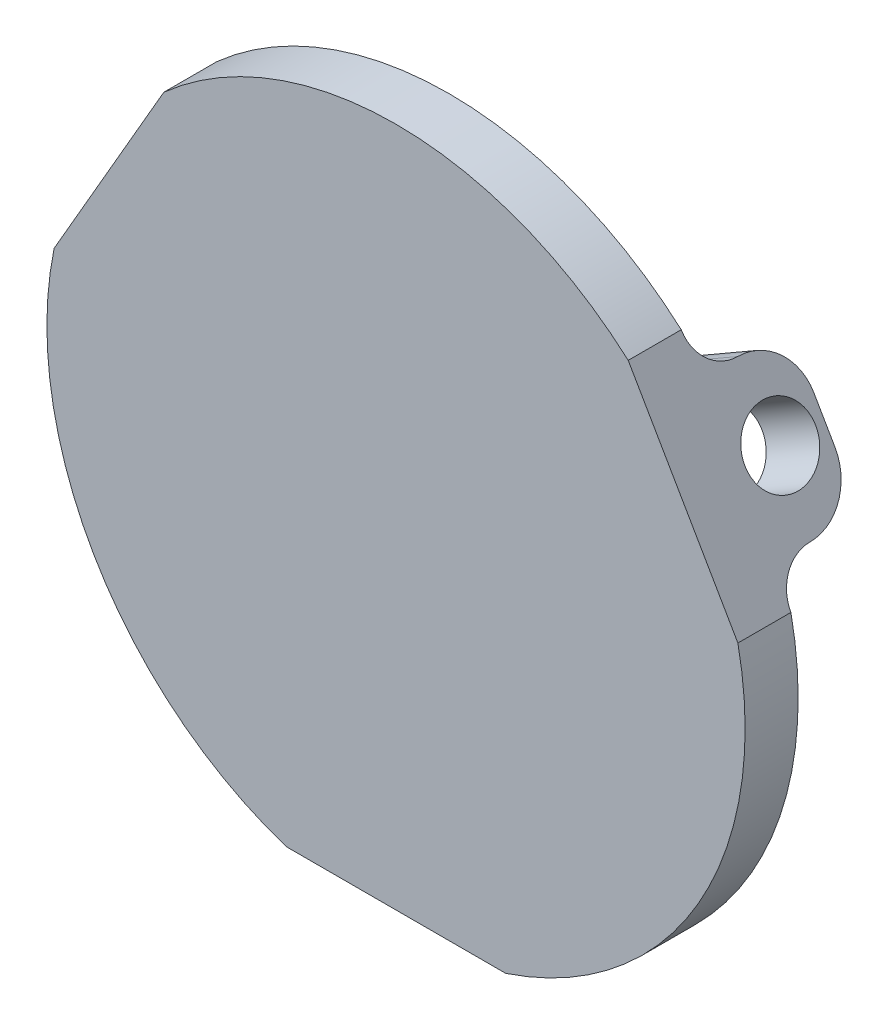
ISO-10303-21;
HEADER;
FILE_DESCRIPTION(('STEP AP214'),'2;1');
FILE_NAME('part.step','',(''),(''),'','','');
FILE_SCHEMA(('AUTOMOTIVE_DESIGN { 1 0 10303 214 1 1 1 1 }'));
ENDSEC;
DATA;
#1=APPLICATION_CONTEXT('core data for automotive mechanical design processes');
#2=APPLICATION_PROTOCOL_DEFINITION('international standard','automotive_design',2000,#1);
#3=PRODUCT_CONTEXT('',#1,'mechanical');
#4=PRODUCT('Part','Part','',(#3));
#5=PRODUCT_RELATED_PRODUCT_CATEGORY('part','',(#4));
#6=PRODUCT_DEFINITION_FORMATION('','',#4);
#7=PRODUCT_DEFINITION_CONTEXT('part definition',#1,'design');
#8=PRODUCT_DEFINITION('design','',#6,#7);
#9=PRODUCT_DEFINITION_SHAPE('','',#8);
#10=(LENGTH_UNIT() NAMED_UNIT(*) SI_UNIT(.MILLI.,.METRE.));
#11=(NAMED_UNIT(*) PLANE_ANGLE_UNIT() SI_UNIT($,.RADIAN.));
#12=(NAMED_UNIT(*) SI_UNIT($,.STERADIAN.) SOLID_ANGLE_UNIT());
#13=UNCERTAINTY_MEASURE_WITH_UNIT(LENGTH_MEASURE(1.E-05),#10,'distance_accuracy_value','');
#14=(GEOMETRIC_REPRESENTATION_CONTEXT(3) GLOBAL_UNCERTAINTY_ASSIGNED_CONTEXT((#13)) GLOBAL_UNIT_ASSIGNED_CONTEXT((#10,
#11,#12)) REPRESENTATION_CONTEXT('',''));
#15=CARTESIAN_POINT('',(0.,0.,0.));
#16=DIRECTION('',(0.,0.,1.));
#17=DIRECTION('',(1.,0.,0.));
#18=AXIS2_PLACEMENT_3D('',#15,#16,#17);
#19=CARTESIAN_POINT('',(77.3615789298239,16.0058147397946,-10.000055));
#20=DIRECTION('',(0.866025403784443,0.499999999999992,0.));
#21=DIRECTION('',(-0.499999999999992,0.866025403784443,0.));
#22=AXIS2_PLACEMENT_3D('',#19,#20,#21);
#23=PLANE('',#22);
#24=CARTESIAN_POINT('',(64.9519052838332,37.4999999999994,0.));
#25=DIRECTION('',(0.866025403784443,0.499999999999992,0.));
#26=DIRECTION('',(-0.499999999999992,0.866025403784443,0.));
#27=AXIS2_PLACEMENT_3D('',#24,#25,#26);
#28=CIRCLE('',#27,8.);
#29=CARTESIAN_POINT('',(60.9519052838333,44.4282032302749,0.));
#30=VERTEX_POINT('',#29);
#31=EDGE_CURVE('E321',#30,#30,#28,.T.);
#32=ORIENTED_EDGE('',*,*,#31,.F.);
#33=EDGE_LOOP('',(#32));
#34=FACE_BOUND('',#33,.T.);
#35=CARTESIAN_POINT('',(62.5422316378424,41.6736771845153,1.48244620479837));
#36=DIRECTION('',(0.866025403784443,0.499999999999992,0.));
#37=DIRECTION('',(-0.499999999999992,0.866025403784443,0.));
#38=AXIS2_PLACEMENT_3D('',#35,#36,#37);
#39=CIRCLE('',#38,11.4824462047984);
#40=CARTESIAN_POINT('',(62.5422316378424,41.6736771845153,-10.));
#41=VERTEX_POINT('',#40);
#42=CARTESIAN_POINT('',(56.8010085354433,51.617767295459,1.48244620479837));
#43=VERTEX_POINT('',#42);
#44=EDGE_CURVE('E55',#41,#43,#39,.T.);
#45=ORIENTED_EDGE('',*,*,#44,.T.);
#46=CARTESIAN_POINT('',(52.5422316378426,58.9941852602042,1.48244620479837));
#47=DIRECTION('',(0.866025403784443,0.499999999999992,0.));
#48=DIRECTION('',(-0.499999999999992,0.866025403784443,0.));
#49=AXIS2_PLACEMENT_3D('',#46,#47,#48);
#50=CIRCLE('',#49,8.51755379520163);
#51=CARTESIAN_POINT('',(52.5422316378425,58.9941852602042,10.));
#52=VERTEX_POINT('',#51);
#53=EDGE_CURVE('E394',#43,#52,#50,.F.);
#54=ORIENTED_EDGE('',*,*,#53,.T.);
#55=DIRECTION('',(0.,0.,-1.));
#56=VECTOR('',#55,1.);
#57=CARTESIAN_POINT('',(52.5422316378426,58.9941852602042,22.));
#58=LINE('',#57,#56);
#59=CARTESIAN_POINT('',(52.5422316378426,58.9941852602042,22.));
#60=VERTEX_POINT('',#59);
#61=EDGE_CURVE('E307',#60,#52,#58,.T.);
#62=ORIENTED_EDGE('',*,*,#61,.F.);
#63=DIRECTION('',(-0.499999999999992,0.866025403784443,0.));
#64=VECTOR('',#63,1.);
#65=CARTESIAN_POINT('',(64.9519052838332,37.4999999999994,22.));
#66=LINE('',#65,#64);
#67=CARTESIAN_POINT('',(77.3615789298239,16.0058147397946,22.));
#68=VERTEX_POINT('',#67);
#69=EDGE_CURVE('E219',#68,#60,#66,.T.);
#70=ORIENTED_EDGE('',*,*,#69,.F.);
#71=DIRECTION('',(0.,0.,-1.));
#72=VECTOR('',#71,1.);
#73=CARTESIAN_POINT('',(77.3615789298239,16.0058147397946,22.));
#74=LINE('',#73,#72);
#75=CARTESIAN_POINT('',(77.3615789298239,16.0058147397946,10.));
#76=VERTEX_POINT('',#75);
#77=EDGE_CURVE('E300',#68,#76,#74,.T.);
#78=ORIENTED_EDGE('',*,*,#77,.T.);
#79=CARTESIAN_POINT('',(77.3615789298239,16.0058147397946,1.48244620479837));
#80=DIRECTION('',(0.866025403784443,0.499999999999992,0.));
#81=DIRECTION('',(-0.499999999999992,0.866025403784443,0.));
#82=AXIS2_PLACEMENT_3D('',#79,#80,#81);
#83=CIRCLE('',#82,8.51755379520163);
#84=CARTESIAN_POINT('',(73.1028020322231,23.3822327045398,1.48244620479837));
#85=VERTEX_POINT('',#84);
#86=EDGE_CURVE('E392',#85,#76,#83,.T.);
#87=ORIENTED_EDGE('',*,*,#86,.F.);
#88=CARTESIAN_POINT('',(67.3615789298241,33.3263228154834,1.48244620479837));
#89=DIRECTION('',(0.866025403784443,0.499999999999992,0.));
#90=DIRECTION('',(-0.499999999999992,0.866025403784443,0.));
#91=AXIS2_PLACEMENT_3D('',#88,#89,#90);
#92=CIRCLE('',#91,11.4824462047984);
#93=CARTESIAN_POINT('',(67.3615789298241,33.3263228154834,-10.));
#94=VERTEX_POINT('',#93);
#95=EDGE_CURVE('E322',#94,#85,#92,.F.);
#96=ORIENTED_EDGE('',*,*,#95,.F.);
#97=DIRECTION('',(-0.499999999999992,0.866025403784443,0.));
#98=VECTOR('',#97,1.);
#99=CARTESIAN_POINT('',(64.9519052838332,37.4999999999994,-10.));
#100=LINE('',#99,#98);
#101=EDGE_CURVE('E203',#94,#41,#100,.T.);
#102=ORIENTED_EDGE('',*,*,#101,.T.);
#103=EDGE_LOOP('',(#45,#54,#62,#70,#78,#87,#96,#102));
#104=FACE_BOUND('',#103,.T.);
#105=ADVANCED_FACE('F40',(#34,#104),#23,.T.);
#106=CARTESIAN_POINT('',(52.827549630851,30.4999999999995,-10.));
#107=DIRECTION('',(0.866025403784443,0.499999999999992,0.));
#108=DIRECTION('',(-0.499999999999992,0.866025403784443,0.));
#109=AXIS2_PLACEMENT_3D('',#106,#107,#108);
#110=PLANE('',#109);
#111=CARTESIAN_POINT('',(52.827549630851,30.4999999999995,0.));
#112=DIRECTION('',(0.866025403784443,0.499999999999992,0.));
#113=DIRECTION('',(-0.499999999999992,0.866025403784443,0.));
#114=AXIS2_PLACEMENT_3D('',#111,#112,#113);
#115=CIRCLE('',#114,8.);
#116=CARTESIAN_POINT('',(48.8275496308511,37.4282032302751,0.));
#117=VERTEX_POINT('',#116);
#118=EDGE_CURVE('E318',#117,#117,#115,.T.);
#119=ORIENTED_EDGE('',*,*,#118,.T.);
#120=EDGE_LOOP('',(#119));
#121=FACE_BOUND('',#120,.T.);
#122=CARTESIAN_POINT('',(40.4178759848604,51.9941852602043,1.48244620479837));
#123=DIRECTION('',(0.866025403784443,0.499999999999992,0.));
#124=DIRECTION('',(-0.499999999999992,0.866025403784443,0.));
#125=AXIS2_PLACEMENT_3D('',#122,#123,#124);
#126=CIRCLE('',#125,8.51755379520163);
#127=CARTESIAN_POINT('',(44.6766528824611,44.6177672954591,1.48244620479837));
#128=VERTEX_POINT('',#127);
#129=CARTESIAN_POINT('',(40.4178759848604,51.9941852602043,10.));
#130=VERTEX_POINT('',#129);
#131=EDGE_CURVE('E196',#128,#130,#126,.F.);
#132=ORIENTED_EDGE('',*,*,#131,.F.);
#133=CARTESIAN_POINT('',(50.4178759848602,34.6736771845155,1.48244620479837));
#134=DIRECTION('',(0.866025403784443,0.499999999999992,0.));
#135=DIRECTION('',(-0.499999999999992,0.866025403784443,0.));
#136=AXIS2_PLACEMENT_3D('',#133,#134,#135);
#137=CIRCLE('',#136,11.4824462047984);
#138=CARTESIAN_POINT('',(50.4178759848602,34.6736771845154,-10.));
#139=VERTEX_POINT('',#138);
#140=EDGE_CURVE('E183',#139,#128,#137,.T.);
#141=ORIENTED_EDGE('',*,*,#140,.F.);
#142=DIRECTION('',(-0.499999999999992,0.866025403784443,0.));
#143=VECTOR('',#142,1.);
#144=CARTESIAN_POINT('',(52.827549630851,30.4999999999995,-10.));
#145=LINE('',#144,#143);
#146=CARTESIAN_POINT('',(55.2372232768419,26.3263228154836,-10.));
#147=VERTEX_POINT('',#146);
#148=EDGE_CURVE('E194',#147,#139,#145,.T.);
#149=ORIENTED_EDGE('',*,*,#148,.F.);
#150=CARTESIAN_POINT('',(55.2372232768419,26.3263228154836,1.48244620479837));
#151=DIRECTION('',(0.866025403784443,0.499999999999992,0.));
#152=DIRECTION('',(-0.499999999999992,0.866025403784443,0.));
#153=AXIS2_PLACEMENT_3D('',#150,#151,#152);
#154=CIRCLE('',#153,11.4824462047984);
#155=CARTESIAN_POINT('',(60.978446379241,16.3822327045399,1.48244620479837));
#156=VERTEX_POINT('',#155);
#157=EDGE_CURVE('E410',#147,#156,#154,.F.);
#158=ORIENTED_EDGE('',*,*,#157,.T.);
#159=CARTESIAN_POINT('',(65.2372232768417,9.00581473979471,1.48244620479837));
#160=DIRECTION('',(0.866025403784443,0.499999999999992,0.));
#161=DIRECTION('',(-0.499999999999992,0.866025403784443,0.));
#162=AXIS2_PLACEMENT_3D('',#159,#160,#161);
#163=CIRCLE('',#162,8.51755379520163);
#164=CARTESIAN_POINT('',(65.2372232768417,9.00581473979471,10.));
#165=VERTEX_POINT('',#164);
#166=EDGE_CURVE('E317',#156,#165,#163,.T.);
#167=ORIENTED_EDGE('',*,*,#166,.T.);
#168=DIRECTION('',(-0.499999999999992,0.866025403784443,0.));
#169=VECTOR('',#168,1.);
#170=CARTESIAN_POINT('',(52.827549630851,30.4999999999995,10.));
#171=LINE('',#170,#169);
#172=EDGE_CURVE('E215',#165,#130,#171,.T.);
#173=ORIENTED_EDGE('',*,*,#172,.T.);
#174=EDGE_LOOP('',(#132,#141,#149,#158,#167,#173));
#175=FACE_BOUND('',#174,.T.);
#176=ADVANCED_FACE('F192',(#121,#175),#110,.F.);
#177=CARTESIAN_POINT('',(-52.5422316378418,58.9941852602049,-10.000055));
#178=DIRECTION('',(-0.866025403784436,0.500000000000004,0.));
#179=DIRECTION('',(-0.500000000000004,-0.866025403784436,0.));
#180=AXIS2_PLACEMENT_3D('',#177,#178,#179);
#181=PLANE('',#180);
#182=CARTESIAN_POINT('',(-64.9519052838327,37.5000000000003,0.));
#183=DIRECTION('',(-0.866025403784436,0.500000000000004,0.));
#184=DIRECTION('',(-0.500000000000004,-0.866025403784436,0.));
#185=AXIS2_PLACEMENT_3D('',#182,#183,#184);
#186=CIRCLE('',#185,8.);
#187=CARTESIAN_POINT('',(-68.9519052838328,30.5717967697248,0.));
#188=VERTEX_POINT('',#187);
#189=EDGE_CURVE('E216',#188,#188,#186,.T.);
#190=ORIENTED_EDGE('',*,*,#189,.F.);
#191=EDGE_LOOP('',(#190));
#192=FACE_BOUND('',#191,.T.);
#193=CARTESIAN_POINT('',(-67.3615789298236,33.3263228154844,1.48244620479837));
#194=DIRECTION('',(-0.866025403784436,0.500000000000004,0.));
#195=DIRECTION('',(-0.500000000000004,-0.866025403784436,0.));
#196=AXIS2_PLACEMENT_3D('',#193,#194,#195);
#197=CIRCLE('',#196,11.4824462047984);
#198=CARTESIAN_POINT('',(-67.3615789298236,33.3263228154844,-10.));
#199=VERTEX_POINT('',#198);
#200=CARTESIAN_POINT('',(-73.1028020322228,23.3822327045408,1.48244620479837));
#201=VERTEX_POINT('',#200);
#202=EDGE_CURVE('E62',#199,#201,#197,.T.);
#203=ORIENTED_EDGE('',*,*,#202,.T.);
#204=CARTESIAN_POINT('',(-77.3615789298237,16.0058147397957,1.48244620479837));
#205=DIRECTION('',(-0.866025403784436,0.500000000000004,0.));
#206=DIRECTION('',(-0.500000000000004,-0.866025403784436,0.));
#207=AXIS2_PLACEMENT_3D('',#204,#205,#206);
#208=CIRCLE('',#207,8.51755379520163);
#209=CARTESIAN_POINT('',(-77.3615789298237,16.0058147397957,10.));
#210=VERTEX_POINT('',#209);
#211=EDGE_CURVE('E367',#201,#210,#208,.F.);
#212=ORIENTED_EDGE('',*,*,#211,.T.);
#213=DIRECTION('',(0.,0.,-1.));
#214=VECTOR('',#213,1.);
#215=CARTESIAN_POINT('',(-77.3615789298237,16.0058147397957,22.));
#216=LINE('',#215,#214);
#217=CARTESIAN_POINT('',(-77.3615789298237,16.0058147397957,22.));
#218=VERTEX_POINT('',#217);
#219=EDGE_CURVE('E313',#218,#210,#216,.T.);
#220=ORIENTED_EDGE('',*,*,#219,.F.);
#221=DIRECTION('',(-0.500000000000004,-0.866025403784436,0.));
#222=VECTOR('',#221,1.);
#223=CARTESIAN_POINT('',(-64.9519052838327,37.5000000000003,22.));
#224=LINE('',#223,#222);
#225=CARTESIAN_POINT('',(-52.5422316378418,58.9941852602049,22.));
#226=VERTEX_POINT('',#225);
#227=EDGE_CURVE('E222',#226,#218,#224,.T.);
#228=ORIENTED_EDGE('',*,*,#227,.F.);
#229=DIRECTION('',(0.,0.,-1.));
#230=VECTOR('',#229,1.);
#231=CARTESIAN_POINT('',(-52.5422316378417,58.9941852602049,22.));
#232=LINE('',#231,#230);
#233=CARTESIAN_POINT('',(-52.5422316378418,58.9941852602049,10.));
#234=VERTEX_POINT('',#233);
#235=EDGE_CURVE('E310',#226,#234,#232,.T.);
#236=ORIENTED_EDGE('',*,*,#235,.T.);
#237=CARTESIAN_POINT('',(-52.5422316378418,58.9941852602049,1.48244620479837));
#238=DIRECTION('',(-0.866025403784436,0.500000000000004,0.));
#239=DIRECTION('',(-0.500000000000004,-0.866025403784436,0.));
#240=AXIS2_PLACEMENT_3D('',#237,#238,#239);
#241=CIRCLE('',#240,8.51755379520163);
#242=CARTESIAN_POINT('',(-56.8010085354426,51.6177672954598,1.48244620479837));
#243=VERTEX_POINT('',#242);
#244=EDGE_CURVE('E330',#243,#234,#241,.T.);
#245=ORIENTED_EDGE('',*,*,#244,.F.);
#246=CARTESIAN_POINT('',(-62.5422316378418,41.6736771845162,1.48244620479837));
#247=DIRECTION('',(-0.866025403784436,0.500000000000004,0.));
#248=DIRECTION('',(-0.500000000000004,-0.866025403784436,0.));
#249=AXIS2_PLACEMENT_3D('',#246,#247,#248);
#250=CIRCLE('',#249,11.4824462047984);
#251=CARTESIAN_POINT('',(-62.5422316378419,41.6736771845162,-10.));
#252=VERTEX_POINT('',#251);
#253=EDGE_CURVE('E345',#252,#243,#250,.F.);
#254=ORIENTED_EDGE('',*,*,#253,.F.);
#255=DIRECTION('',(-0.500000000000004,-0.866025403784436,0.));
#256=VECTOR('',#255,1.);
#257=CARTESIAN_POINT('',(-64.9519052838327,37.5000000000003,-10.));
#258=LINE('',#257,#256);
#259=EDGE_CURVE('E337',#252,#199,#258,.T.);
#260=ORIENTED_EDGE('',*,*,#259,.T.);
#261=EDGE_LOOP('',(#203,#212,#220,#228,#236,#245,#254,#260));
#262=FACE_BOUND('',#261,.T.);
#263=ADVANCED_FACE('F342',(#192,#262),#181,.T.);
#264=CARTESIAN_POINT('',(-52.8275496308506,30.5000000000002,-10.));
#265=DIRECTION('',(-0.866025403784436,0.500000000000004,0.));
#266=DIRECTION('',(-0.500000000000004,-0.866025403784436,0.));
#267=AXIS2_PLACEMENT_3D('',#264,#265,#266);
#268=PLANE('',#267);
#269=CARTESIAN_POINT('',(-52.8275496308506,30.5000000000003,0.));
#270=DIRECTION('',(-0.866025403784436,0.500000000000004,0.));
#271=DIRECTION('',(-0.500000000000004,-0.866025403784436,0.));
#272=AXIS2_PLACEMENT_3D('',#269,#270,#271);
#273=CIRCLE('',#272,8.);
#274=CARTESIAN_POINT('',(-56.8275496308507,23.5717967697248,0.));
#275=VERTEX_POINT('',#274);
#276=EDGE_CURVE('E328',#275,#275,#273,.T.);
#277=ORIENTED_EDGE('',*,*,#276,.T.);
#278=EDGE_LOOP('',(#277));
#279=FACE_BOUND('',#278,.T.);
#280=CARTESIAN_POINT('',(-65.2372232768416,9.00581473979561,1.48244620479837));
#281=DIRECTION('',(-0.866025403784436,0.500000000000004,0.));
#282=DIRECTION('',(-0.500000000000004,-0.866025403784436,0.));
#283=AXIS2_PLACEMENT_3D('',#280,#281,#282);
#284=CIRCLE('',#283,8.51755379520163);
#285=CARTESIAN_POINT('',(-60.9784463792408,16.3822327045408,1.48244620479837));
#286=VERTEX_POINT('',#285);
#287=CARTESIAN_POINT('',(-65.2372232768416,9.00581473979561,10.));
#288=VERTEX_POINT('',#287);
#289=EDGE_CURVE('E357',#286,#288,#284,.F.);
#290=ORIENTED_EDGE('',*,*,#289,.F.);
#291=CARTESIAN_POINT('',(-55.2372232768415,26.3263228154844,1.48244620479837));
#292=DIRECTION('',(-0.866025403784436,0.500000000000004,0.));
#293=DIRECTION('',(-0.500000000000004,-0.866025403784436,0.));
#294=AXIS2_PLACEMENT_3D('',#291,#292,#293);
#295=CIRCLE('',#294,11.4824462047984);
#296=CARTESIAN_POINT('',(-55.2372232768415,26.3263228154843,-10.));
#297=VERTEX_POINT('',#296);
#298=EDGE_CURVE('E420',#297,#286,#295,.T.);
#299=ORIENTED_EDGE('',*,*,#298,.F.);
#300=DIRECTION('',(-0.500000000000004,-0.866025403784436,0.));
#301=VECTOR('',#300,1.);
#302=CARTESIAN_POINT('',(-52.8275496308506,30.5000000000002,-10.));
#303=LINE('',#302,#301);
#304=CARTESIAN_POINT('',(-50.4178759848597,34.6736771845161,-10.));
#305=VERTEX_POINT('',#304);
#306=EDGE_CURVE('E223',#305,#297,#303,.T.);
#307=ORIENTED_EDGE('',*,*,#306,.F.);
#308=CARTESIAN_POINT('',(-50.4178759848597,34.6736771845161,1.48244620479837));
#309=DIRECTION('',(-0.866025403784436,0.500000000000004,0.));
#310=DIRECTION('',(-0.500000000000004,-0.866025403784436,0.));
#311=AXIS2_PLACEMENT_3D('',#308,#309,#310);
#312=CIRCLE('',#311,11.4824462047984);
#313=CARTESIAN_POINT('',(-44.6766528824606,44.6177672954597,1.48244620479837));
#314=VERTEX_POINT('',#313);
#315=EDGE_CURVE('E402',#305,#314,#312,.F.);
#316=ORIENTED_EDGE('',*,*,#315,.T.);
#317=CARTESIAN_POINT('',(-40.4178759848597,51.9941852602049,1.48244620479837));
#318=DIRECTION('',(-0.866025403784436,0.500000000000004,0.));
#319=DIRECTION('',(-0.500000000000004,-0.866025403784436,0.));
#320=AXIS2_PLACEMENT_3D('',#317,#318,#319);
#321=CIRCLE('',#320,8.51755379520163);
#322=CARTESIAN_POINT('',(-40.4178759848597,51.9941852602049,10.));
#323=VERTEX_POINT('',#322);
#324=EDGE_CURVE('E325',#314,#323,#321,.T.);
#325=ORIENTED_EDGE('',*,*,#324,.T.);
#326=DIRECTION('',(-0.500000000000004,-0.866025403784436,0.));
#327=VECTOR('',#326,1.);
#328=CARTESIAN_POINT('',(-52.8275496308506,30.5000000000002,10.));
#329=LINE('',#328,#327);
#330=EDGE_CURVE('E206',#323,#288,#329,.T.);
#331=ORIENTED_EDGE('',*,*,#330,.T.);
#332=EDGE_LOOP('',(#290,#299,#307,#316,#325,#331));
#333=FACE_BOUND('',#332,.T.);
#334=ADVANCED_FACE('F356',(#279,#333),#268,.F.);
#335=CARTESIAN_POINT('',(0.,0.,10.));
#336=DIRECTION('',(0.,0.,1.));
#337=DIRECTION('',(1.,0.,0.));
#338=AXIS2_PLACEMENT_3D('',#335,#336,#337);
#339=PLANE('',#338);
#340=DIRECTION('',(0.,1.,0.));
#341=VECTOR('',#340,1.);
#342=CARTESIAN_POINT('',(-24.8193472919817,0.,10.));
#343=LINE('',#342,#341);
#344=CARTESIAN_POINT('',(-24.8193472919817,-75.,10.));
#345=VERTEX_POINT('',#344);
#346=CARTESIAN_POINT('',(-24.8193472919817,-61.,10.));
#347=VERTEX_POINT('',#346);
#348=EDGE_CURVE('E268',#345,#347,#343,.T.);
#349=ORIENTED_EDGE('',*,*,#348,.F.);
#350=CARTESIAN_POINT('',(0.,0.,10.));
#351=DIRECTION('',(0.,0.,1.));
#352=DIRECTION('',(1.,0.,0.));
#353=AXIS2_PLACEMENT_3D('',#350,#351,#352);
#354=CIRCLE('',#353,79.);
#355=EDGE_CURVE('E303',#210,#345,#354,.T.);
#356=ORIENTED_EDGE('',*,*,#355,.F.);
#357=DIRECTION('',(0.866025403784436,-0.500000000000004,0.));
#358=VECTOR('',#357,1.);
#359=CARTESIAN_POINT('',(-12.409673645991,-21.4941852602046,10.));
#360=LINE('',#359,#358);
#361=EDGE_CURVE('E202',#210,#288,#360,.T.);
#362=ORIENTED_EDGE('',*,*,#361,.T.);
#363=ORIENTED_EDGE('',*,*,#330,.F.);
#364=DIRECTION('',(0.866025403784436,-0.500000000000004,0.));
#365=VECTOR('',#364,1.);
#366=CARTESIAN_POINT('',(12.409673645991,21.4941852602046,10.));
#367=LINE('',#366,#365);
#368=EDGE_CURVE('E346',#234,#323,#367,.T.);
#369=ORIENTED_EDGE('',*,*,#368,.F.);
#370=EDGE_CURVE('E297',#52,#234,#354,.T.);
#371=ORIENTED_EDGE('',*,*,#370,.F.);
#372=DIRECTION('',(-0.866025403784443,-0.499999999999992,0.));
#373=VECTOR('',#372,1.);
#374=CARTESIAN_POINT('',(-12.4096736459907,21.4941852602048,10.));
#375=LINE('',#374,#373);
#376=EDGE_CURVE('E212',#52,#130,#375,.T.);
#377=ORIENTED_EDGE('',*,*,#376,.T.);
#378=ORIENTED_EDGE('',*,*,#172,.F.);
#379=DIRECTION('',(-0.866025403784443,-0.499999999999992,0.));
#380=VECTOR('',#379,1.);
#381=CARTESIAN_POINT('',(12.4096736459907,-21.4941852602048,10.));
#382=LINE('',#381,#380);
#383=EDGE_CURVE('E208',#76,#165,#382,.T.);
#384=ORIENTED_EDGE('',*,*,#383,.F.);
#385=CARTESIAN_POINT('',(24.8193472919817,-74.9999999999999,10.));
#386=VERTEX_POINT('',#385);
#387=EDGE_CURVE('E294',#386,#76,#354,.T.);
#388=ORIENTED_EDGE('',*,*,#387,.F.);
#389=DIRECTION('',(0.,1.,0.));
#390=VECTOR('',#389,1.);
#391=CARTESIAN_POINT('',(24.8193472919817,0.,10.));
#392=LINE('',#391,#390);
#393=CARTESIAN_POINT('',(24.8193472919817,-61.,10.));
#394=VERTEX_POINT('',#393);
#395=EDGE_CURVE('E256',#386,#394,#392,.T.);
#396=ORIENTED_EDGE('',*,*,#395,.T.);
#397=DIRECTION('',(1.,0.,0.));
#398=VECTOR('',#397,1.);
#399=CARTESIAN_POINT('',(0.,-61.,10.));
#400=LINE('',#399,#398);
#401=EDGE_CURVE('E284',#347,#394,#400,.T.);
#402=ORIENTED_EDGE('',*,*,#401,.F.);
#403=EDGE_LOOP('',(#349,#356,#362,#363,#369,#371,#377,#378,#384,#388,#396,#402));
#404=FACE_BOUND('',#403,.T.);
#405=ADVANCED_FACE('F363',(#404),#339,.F.);
#406=CARTESIAN_POINT('',(0.,0.,22.));
#407=DIRECTION('',(0.,0.,1.));
#408=DIRECTION('',(1.,0.,0.));
#409=AXIS2_PLACEMENT_3D('',#406,#407,#408);
#410=PLANE('',#409);
#411=CARTESIAN_POINT('',(0.,0.,22.));
#412=DIRECTION('',(0.,0.,1.));
#413=DIRECTION('',(1.,0.,0.));
#414=AXIS2_PLACEMENT_3D('',#411,#412,#413);
#415=CIRCLE('',#414,79.);
#416=EDGE_CURVE('E376',#60,#226,#415,.T.);
#417=ORIENTED_EDGE('',*,*,#416,.T.);
#418=ORIENTED_EDGE('',*,*,#227,.T.);
#419=CARTESIAN_POINT('',(-24.8193472919817,-75.,22.));
#420=VERTEX_POINT('',#419);
#421=EDGE_CURVE('E296',#218,#420,#415,.T.);
#422=ORIENTED_EDGE('',*,*,#421,.T.);
#423=DIRECTION('',(1.,0.,0.));
#424=VECTOR('',#423,1.);
#425=CARTESIAN_POINT('',(-24.8193472919817,-75.,22.));
#426=LINE('',#425,#424);
#427=CARTESIAN_POINT('',(24.8193472919817,-75.,22.));
#428=VERTEX_POINT('',#427);
#429=EDGE_CURVE('E291',#420,#428,#426,.T.);
#430=ORIENTED_EDGE('',*,*,#429,.T.);
#431=EDGE_CURVE('E275',#428,#68,#415,.T.);
#432=ORIENTED_EDGE('',*,*,#431,.T.);
#433=ORIENTED_EDGE('',*,*,#69,.T.);
#434=EDGE_LOOP('',(#417,#418,#422,#430,#432,#433));
#435=FACE_BOUND('',#434,.T.);
#436=ADVANCED_FACE('F381',(#435),#410,.T.);
#437=CARTESIAN_POINT('',(0.,0.,22.));
#438=DIRECTION('',(0.,0.,-1.));
#439=DIRECTION('',(-1.,0.,0.));
#440=AXIS2_PLACEMENT_3D('',#437,#438,#439);
#441=CYLINDRICAL_SURFACE('',#440,79.);
#442=ORIENTED_EDGE('',*,*,#235,.F.);
#443=ORIENTED_EDGE('',*,*,#416,.F.);
#444=ORIENTED_EDGE('',*,*,#61,.T.);
#445=ORIENTED_EDGE('',*,*,#370,.T.);
#446=EDGE_LOOP('',(#442,#443,#444,#445));
#447=FACE_BOUND('',#446,.T.);
#448=ADVANCED_FACE('F398',(#447),#441,.T.);
#449=ORIENTED_EDGE('',*,*,#77,.F.);
#450=ORIENTED_EDGE('',*,*,#431,.F.);
#451=DIRECTION('',(0.,0.,1.));
#452=VECTOR('',#451,1.);
#453=CARTESIAN_POINT('',(24.8193472919817,-75.,9.999988));
#454=LINE('',#453,#452);
#455=EDGE_CURVE('E290',#386,#428,#454,.T.);
#456=ORIENTED_EDGE('',*,*,#455,.F.);
#457=ORIENTED_EDGE('',*,*,#387,.T.);
#458=EDGE_LOOP('',(#449,#450,#456,#457));
#459=FACE_BOUND('',#458,.T.);
#460=ADVANCED_FACE('F386',(#459),#441,.T.);
#461=CARTESIAN_POINT('',(-24.8193472919817,-75.,9.999988));
#462=DIRECTION('',(0.,-1.,0.));
#463=DIRECTION('',(0.,0.,-1.));
#464=AXIS2_PLACEMENT_3D('',#461,#462,#463);
#465=PLANE('',#464);
#466=CARTESIAN_POINT('',(0.,-75.,0.));
#467=DIRECTION('',(0.,-1.,0.));
#468=DIRECTION('',(0.,0.,-1.));
#469=AXIS2_PLACEMENT_3D('',#466,#467,#468);
#470=CIRCLE('',#469,8.);
#471=CARTESIAN_POINT('',(0.,-75.,-8.));
#472=VERTEX_POINT('',#471);
#473=EDGE_CURVE('E250',#472,#472,#470,.T.);
#474=ORIENTED_EDGE('',*,*,#473,.F.);
#475=EDGE_LOOP('',(#474));
#476=FACE_BOUND('',#475,.T.);
#477=CARTESIAN_POINT('',(4.81934729198173,-75.,1.48244620479837));
#478=DIRECTION('',(0.,-1.,0.));
#479=DIRECTION('',(0.,0.,-1.));
#480=AXIS2_PLACEMENT_3D('',#477,#478,#479);
#481=CIRCLE('',#480,11.4824462047984);
#482=CARTESIAN_POINT('',(4.81934729198173,-75.,-10.));
#483=VERTEX_POINT('',#482);
#484=CARTESIAN_POINT('',(16.3017934967801,-74.9999999999999,1.48244620479837));
#485=VERTEX_POINT('',#484);
#486=EDGE_CURVE('E231',#483,#485,#481,.T.);
#487=ORIENTED_EDGE('',*,*,#486,.T.);
#488=CARTESIAN_POINT('',(24.8193472919817,-75.,1.48244620479837));
#489=DIRECTION('',(0.,-1.,0.));
#490=DIRECTION('',(0.,0.,-1.));
#491=AXIS2_PLACEMENT_3D('',#488,#489,#490);
#492=CIRCLE('',#491,8.51755379520163);
#493=EDGE_CURVE('E236',#485,#386,#492,.F.);
#494=ORIENTED_EDGE('',*,*,#493,.T.);
#495=ORIENTED_EDGE('',*,*,#455,.T.);
#496=ORIENTED_EDGE('',*,*,#429,.F.);
#497=DIRECTION('',(0.,0.,1.));
#498=VECTOR('',#497,1.);
#499=CARTESIAN_POINT('',(-24.8193472919817,-75.,9.999988));
#500=LINE('',#499,#498);
#501=EDGE_CURVE('E287',#345,#420,#500,.T.);
#502=ORIENTED_EDGE('',*,*,#501,.F.);
#503=CARTESIAN_POINT('',(-24.8193472919817,-75.,1.48244620479837));
#504=DIRECTION('',(0.,-1.,0.));
#505=DIRECTION('',(0.,0.,-1.));
#506=AXIS2_PLACEMENT_3D('',#503,#504,#505);
#507=CIRCLE('',#506,8.51755379520163);
#508=CARTESIAN_POINT('',(-16.3017934967801,-75.,1.48244620479837));
#509=VERTEX_POINT('',#508);
#510=EDGE_CURVE('E253',#509,#345,#507,.T.);
#511=ORIENTED_EDGE('',*,*,#510,.F.);
#512=CARTESIAN_POINT('',(-4.81934729198173,-75.,1.48244620479837));
#513=DIRECTION('',(0.,-1.,0.));
#514=DIRECTION('',(0.,0.,-1.));
#515=AXIS2_PLACEMENT_3D('',#512,#513,#514);
#516=CIRCLE('',#515,11.4824462047984);
#517=CARTESIAN_POINT('',(-4.81934729198173,-75.,-10.));
#518=VERTEX_POINT('',#517);
#519=EDGE_CURVE('E245',#518,#509,#516,.F.);
#520=ORIENTED_EDGE('',*,*,#519,.F.);
#521=DIRECTION('',(1.,0.,0.));
#522=VECTOR('',#521,1.);
#523=CARTESIAN_POINT('',(0.,-75.,-10.));
#524=LINE('',#523,#522);
#525=EDGE_CURVE('E264',#518,#483,#524,.T.);
#526=ORIENTED_EDGE('',*,*,#525,.T.);
#527=EDGE_LOOP('',(#487,#494,#495,#496,#502,#511,#520,#526));
#528=FACE_BOUND('',#527,.T.);
#529=ADVANCED_FACE('F445',(#476,#528),#465,.T.);
#530=CARTESIAN_POINT('',(0.,-61.,-10.));
#531=DIRECTION('',(0.,-1.,0.));
#532=DIRECTION('',(0.,0.,-1.));
#533=AXIS2_PLACEMENT_3D('',#530,#531,#532);
#534=PLANE('',#533);
#535=CARTESIAN_POINT('',(0.,-61.,0.));
#536=DIRECTION('',(0.,-1.,0.));
#537=DIRECTION('',(0.,0.,-1.));
#538=AXIS2_PLACEMENT_3D('',#535,#536,#537);
#539=CIRCLE('',#538,8.);
#540=CARTESIAN_POINT('',(0.,-61.,-8.));
#541=VERTEX_POINT('',#540);
#542=EDGE_CURVE('E247',#541,#541,#539,.T.);
#543=ORIENTED_EDGE('',*,*,#542,.T.);
#544=EDGE_LOOP('',(#543));
#545=FACE_BOUND('',#544,.T.);
#546=CARTESIAN_POINT('',(24.8193472919817,-61.,1.48244620479837));
#547=DIRECTION('',(0.,-1.,0.));
#548=DIRECTION('',(0.,0.,-1.));
#549=AXIS2_PLACEMENT_3D('',#546,#547,#548);
#550=CIRCLE('',#549,8.51755379520163);
#551=CARTESIAN_POINT('',(16.3017934967801,-60.9999999999999,1.48244620479837));
#552=VERTEX_POINT('',#551);
#553=EDGE_CURVE('E234',#552,#394,#550,.F.);
#554=ORIENTED_EDGE('',*,*,#553,.F.);
#555=CARTESIAN_POINT('',(4.81934729198173,-61.,1.48244620479837));
#556=DIRECTION('',(0.,-1.,0.));
#557=DIRECTION('',(0.,0.,-1.));
#558=AXIS2_PLACEMENT_3D('',#555,#556,#557);
#559=CIRCLE('',#558,11.4824462047984);
#560=CARTESIAN_POINT('',(4.81934729198173,-60.9999999999999,-10.));
#561=VERTEX_POINT('',#560);
#562=EDGE_CURVE('E229',#561,#552,#559,.T.);
#563=ORIENTED_EDGE('',*,*,#562,.F.);
#564=DIRECTION('',(1.,0.,0.));
#565=VECTOR('',#564,1.);
#566=CARTESIAN_POINT('',(0.,-61.,-10.));
#567=LINE('',#566,#565);
#568=CARTESIAN_POINT('',(-4.81934729198173,-61.,-10.));
#569=VERTEX_POINT('',#568);
#570=EDGE_CURVE('E261',#569,#561,#567,.T.);
#571=ORIENTED_EDGE('',*,*,#570,.F.);
#572=CARTESIAN_POINT('',(-4.81934729198173,-61.,1.48244620479837));
#573=DIRECTION('',(0.,-1.,0.));
#574=DIRECTION('',(0.,0.,-1.));
#575=AXIS2_PLACEMENT_3D('',#572,#573,#574);
#576=CIRCLE('',#575,11.4824462047984);
#577=CARTESIAN_POINT('',(-16.3017934967801,-61.,1.48244620479837));
#578=VERTEX_POINT('',#577);
#579=EDGE_CURVE('E242',#569,#578,#576,.F.);
#580=ORIENTED_EDGE('',*,*,#579,.T.);
#581=CARTESIAN_POINT('',(-24.8193472919817,-61.,1.48244620479837));
#582=DIRECTION('',(0.,-1.,0.));
#583=DIRECTION('',(0.,0.,-1.));
#584=AXIS2_PLACEMENT_3D('',#581,#582,#583);
#585=CIRCLE('',#584,8.51755379520163);
#586=EDGE_CURVE('E274',#578,#347,#585,.T.);
#587=ORIENTED_EDGE('',*,*,#586,.T.);
#588=ORIENTED_EDGE('',*,*,#401,.T.);
#589=EDGE_LOOP('',(#554,#563,#571,#580,#587,#588));
#590=FACE_BOUND('',#589,.T.);
#591=ADVANCED_FACE('F440',(#545,#590),#534,.F.);
#592=ORIENTED_EDGE('',*,*,#421,.F.);
#593=ORIENTED_EDGE('',*,*,#219,.T.);
#594=ORIENTED_EDGE('',*,*,#355,.T.);
#595=ORIENTED_EDGE('',*,*,#501,.T.);
#596=EDGE_LOOP('',(#592,#593,#594,#595));
#597=FACE_BOUND('',#596,.T.);
#598=ADVANCED_FACE('F42',(#597),#441,.T.);
#599=CARTESIAN_POINT('',(0.,0.,-10.));
#600=DIRECTION('',(0.,0.,1.));
#601=DIRECTION('',(1.,0.,0.));
#602=AXIS2_PLACEMENT_3D('',#599,#600,#601);
#603=PLANE('',#602);
#604=ORIENTED_EDGE('',*,*,#570,.T.);
#605=DIRECTION('',(0.,-1.,0.));
#606=VECTOR('',#605,1.);
#607=CARTESIAN_POINT('',(4.81934729198173,79.000025,-10.));
#608=LINE('',#607,#606);
#609=EDGE_CURVE('E282',#561,#483,#608,.T.);
#610=ORIENTED_EDGE('',*,*,#609,.T.);
#611=ORIENTED_EDGE('',*,*,#525,.F.);
#612=DIRECTION('',(0.,-1.,0.));
#613=VECTOR('',#612,1.);
#614=CARTESIAN_POINT('',(-4.81934729198173,79.,-10.));
#615=LINE('',#614,#613);
#616=EDGE_CURVE('E271',#518,#569,#615,.F.);
#617=ORIENTED_EDGE('',*,*,#616,.T.);
#618=EDGE_LOOP('',(#604,#610,#611,#617));
#619=FACE_BOUND('',#618,.T.);
#620=ADVANCED_FACE('F453',(#619),#603,.F.);
#621=CARTESIAN_POINT('',(-24.8193472919817,79.,1.48244620479837));
#622=DIRECTION('',(0.,-1.,0.));
#623=DIRECTION('',(0.,0.,-1.));
#624=AXIS2_PLACEMENT_3D('',#621,#622,#623);
#625=CYLINDRICAL_SURFACE('',#624,8.51755379520163);
#626=ORIENTED_EDGE('',*,*,#510,.T.);
#627=ORIENTED_EDGE('',*,*,#348,.T.);
#628=ORIENTED_EDGE('',*,*,#586,.F.);
#629=DIRECTION('',(0.,-1.,0.));
#630=VECTOR('',#629,1.);
#631=CARTESIAN_POINT('',(-16.3017934967801,79.,1.48244620479837));
#632=LINE('',#631,#630);
#633=EDGE_CURVE('E239',#578,#509,#632,.T.);
#634=ORIENTED_EDGE('',*,*,#633,.T.);
#635=EDGE_LOOP('',(#626,#627,#628,#634));
#636=FACE_BOUND('',#635,.T.);
#637=ADVANCED_FACE('F461',(#636),#625,.F.);
#638=CARTESIAN_POINT('',(-4.81934729198173,79.,1.48244620479837));
#639=DIRECTION('',(0.,-1.,0.));
#640=DIRECTION('',(0.,0.,-1.));
#641=AXIS2_PLACEMENT_3D('',#638,#639,#640);
#642=CYLINDRICAL_SURFACE('',#641,11.4824462047984);
#643=ORIENTED_EDGE('',*,*,#519,.T.);
#644=ORIENTED_EDGE('',*,*,#633,.F.);
#645=ORIENTED_EDGE('',*,*,#579,.F.);
#646=ORIENTED_EDGE('',*,*,#616,.F.);
#647=EDGE_LOOP('',(#643,#644,#645,#646));
#648=FACE_BOUND('',#647,.T.);
#649=ADVANCED_FACE('F457',(#648),#642,.T.);
#650=CARTESIAN_POINT('',(0.,79.,0.));
#651=DIRECTION('',(0.,-1.,0.));
#652=DIRECTION('',(0.,0.,-1.));
#653=AXIS2_PLACEMENT_3D('',#650,#651,#652);
#654=CYLINDRICAL_SURFACE('',#653,8.);
#655=ORIENTED_EDGE('',*,*,#473,.T.);
#656=EDGE_LOOP('',(#655));
#657=FACE_BOUND('',#656,.T.);
#658=ORIENTED_EDGE('',*,*,#542,.F.);
#659=EDGE_LOOP('',(#658));
#660=FACE_BOUND('',#659,.T.);
#661=ADVANCED_FACE('F468',(#657,#660),#654,.F.);
#662=CARTESIAN_POINT('',(24.8193472919817,79.000025,1.48244620479837));
#663=DIRECTION('',(0.,-1.,0.));
#664=DIRECTION('',(0.,0.,-1.));
#665=AXIS2_PLACEMENT_3D('',#662,#663,#664);
#666=CYLINDRICAL_SURFACE('',#665,8.51755379520163);
#667=DIRECTION('',(0.,-1.,0.));
#668=VECTOR('',#667,1.);
#669=CARTESIAN_POINT('',(16.3017934967801,79.000025,1.48244620479837));
#670=LINE('',#669,#668);
#671=EDGE_CURVE('E226',#552,#485,#670,.T.);
#672=ORIENTED_EDGE('',*,*,#671,.F.);
#673=ORIENTED_EDGE('',*,*,#553,.T.);
#674=ORIENTED_EDGE('',*,*,#395,.F.);
#675=ORIENTED_EDGE('',*,*,#493,.F.);
#676=EDGE_LOOP('',(#672,#673,#674,#675));
#677=FACE_BOUND('',#676,.T.);
#678=ADVANCED_FACE('F447',(#677),#666,.F.);
#679=CARTESIAN_POINT('',(4.81934729198173,79.000025,1.48244620479837));
#680=DIRECTION('',(0.,-1.,0.));
#681=DIRECTION('',(0.,0.,-1.));
#682=AXIS2_PLACEMENT_3D('',#679,#680,#681);
#683=CYLINDRICAL_SURFACE('',#682,11.4824462047984);
#684=ORIENTED_EDGE('',*,*,#609,.F.);
#685=ORIENTED_EDGE('',*,*,#562,.T.);
#686=ORIENTED_EDGE('',*,*,#671,.T.);
#687=ORIENTED_EDGE('',*,*,#486,.F.);
#688=EDGE_LOOP('',(#684,#685,#686,#687));
#689=FACE_BOUND('',#688,.T.);
#690=ADVANCED_FACE('F449',(#689),#683,.T.);
#691=CARTESIAN_POINT('',(0.,0.,-10.));
#692=DIRECTION('',(0.,0.,1.));
#693=DIRECTION('',(-0.500000000000004,-0.866025403784436,0.));
#694=AXIS2_PLACEMENT_3D('',#691,#692,#693);
#695=PLANE('',#694);
#696=ORIENTED_EDGE('',*,*,#306,.T.);
#697=DIRECTION('',(-0.866025403784436,0.500000000000004,0.));
#698=VECTOR('',#697,1.);
#699=CARTESIAN_POINT('',(89.316302811624,-57.1316943840017,-10.));
#700=LINE('',#699,#698);
#701=EDGE_CURVE('E48',#297,#199,#700,.T.);
#702=ORIENTED_EDGE('',*,*,#701,.T.);
#703=ORIENTED_EDGE('',*,*,#259,.F.);
#704=DIRECTION('',(-0.866025403784436,0.500000000000004,0.));
#705=VECTOR('',#704,1.);
#706=CARTESIAN_POINT('',(94.1356501036058,-48.7843400149699,-10.));
#707=LINE('',#706,#705);
#708=EDGE_CURVE('E413',#305,#252,#707,.T.);
#709=ORIENTED_EDGE('',*,*,#708,.F.);
#710=EDGE_LOOP('',(#696,#702,#703,#709));
#711=FACE_BOUND('',#710,.T.);
#712=ADVANCED_FACE('F335',(#711),#695,.F.);
#713=CARTESIAN_POINT('',(0.,0.,-10.));
#714=DIRECTION('',(0.,0.,1.));
#715=DIRECTION('',(-0.499999999999992,0.866025403784443,0.));
#716=AXIS2_PLACEMENT_3D('',#713,#714,#715);
#717=PLANE('',#716);
#718=ORIENTED_EDGE('',*,*,#148,.T.);
#719=DIRECTION('',(0.866025403784443,0.499999999999992,0.));
#720=VECTOR('',#719,1.);
#721=CARTESIAN_POINT('',(-94.1356688536061,-48.7843508402859,-10.));
#722=LINE('',#721,#720);
#723=EDGE_CURVE('E11',#139,#41,#722,.T.);
#724=ORIENTED_EDGE('',*,*,#723,.T.);
#725=ORIENTED_EDGE('',*,*,#101,.F.);
#726=DIRECTION('',(0.866025403784443,0.499999999999992,0.));
#727=VECTOR('',#726,1.);
#728=CARTESIAN_POINT('',(-89.3163215616245,-57.1317052093178,-10.));
#729=LINE('',#728,#727);
#730=EDGE_CURVE('E201',#94,#147,#729,.F.);
#731=ORIENTED_EDGE('',*,*,#730,.T.);
#732=EDGE_LOOP('',(#718,#724,#725,#731));
#733=FACE_BOUND('',#732,.T.);
#734=ADVANCED_FACE('F200',(#733),#717,.F.);
#735=CARTESIAN_POINT('',(-89.3163215616245,-57.1317052093178,1.48244620479837));
#736=DIRECTION('',(0.866025403784443,0.499999999999992,0.));
#737=DIRECTION('',(-0.499999999999992,0.866025403784443,0.));
#738=AXIS2_PLACEMENT_3D('',#735,#736,#737);
#739=CYLINDRICAL_SURFACE('',#738,11.4824462047984);
#740=ORIENTED_EDGE('',*,*,#95,.T.);
#741=DIRECTION('',(0.866025403784443,0.499999999999992,0.));
#742=VECTOR('',#741,1.);
#743=CARTESIAN_POINT('',(-83.5750984592254,-67.0757953202615,1.48244620479837));
#744=LINE('',#743,#742);
#745=EDGE_CURVE('E368',#156,#85,#744,.T.);
#746=ORIENTED_EDGE('',*,*,#745,.F.);
#747=ORIENTED_EDGE('',*,*,#157,.F.);
#748=ORIENTED_EDGE('',*,*,#730,.F.);
#749=EDGE_LOOP('',(#740,#746,#747,#748));
#750=FACE_BOUND('',#749,.T.);
#751=ADVANCED_FACE('F430',(#750),#739,.T.);
#752=CARTESIAN_POINT('',(-79.3163215616247,-74.4522132850067,1.48244620479837));
#753=DIRECTION('',(0.866025403784443,0.499999999999992,0.));
#754=DIRECTION('',(-0.499999999999992,0.866025403784443,0.));
#755=AXIS2_PLACEMENT_3D('',#752,#753,#754);
#756=CYLINDRICAL_SURFACE('',#755,8.51755379520163);
#757=ORIENTED_EDGE('',*,*,#86,.T.);
#758=ORIENTED_EDGE('',*,*,#383,.T.);
#759=ORIENTED_EDGE('',*,*,#166,.F.);
#760=ORIENTED_EDGE('',*,*,#745,.T.);
#761=EDGE_LOOP('',(#757,#758,#759,#760));
#762=FACE_BOUND('',#761,.T.);
#763=ADVANCED_FACE('F432',(#762),#756,.F.);
#764=CARTESIAN_POINT('',(-91.7259952076153,-52.9580280248019,0.));
#765=DIRECTION('',(0.866025403784443,0.499999999999992,0.));
#766=DIRECTION('',(-0.499999999999992,0.866025403784443,0.));
#767=AXIS2_PLACEMENT_3D('',#764,#765,#766);
#768=CYLINDRICAL_SURFACE('',#767,8.);
#769=ORIENTED_EDGE('',*,*,#31,.T.);
#770=EDGE_LOOP('',(#769));
#771=FACE_BOUND('',#770,.T.);
#772=ORIENTED_EDGE('',*,*,#118,.F.);
#773=EDGE_LOOP('',(#772));
#774=FACE_BOUND('',#773,.T.);
#775=ADVANCED_FACE('F589',(#771,#774),#768,.F.);
#776=CARTESIAN_POINT('',(94.1356501036058,-48.7843400149699,1.48244620479837));
#777=DIRECTION('',(-0.866025403784436,0.500000000000004,0.));
#778=DIRECTION('',(-0.500000000000004,-0.866025403784436,0.));
#779=AXIS2_PLACEMENT_3D('',#776,#777,#778);
#780=CYLINDRICAL_SURFACE('',#779,11.4824462047984);
#781=ORIENTED_EDGE('',*,*,#253,.T.);
#782=DIRECTION('',(-0.866025403784436,0.500000000000004,0.));
#783=VECTOR('',#782,1.);
#784=CARTESIAN_POINT('',(99.876873206005,-38.8402499040263,1.48244620479837));
#785=LINE('',#784,#783);
#786=EDGE_CURVE('E412',#314,#243,#785,.T.);
#787=ORIENTED_EDGE('',*,*,#786,.F.);
#788=ORIENTED_EDGE('',*,*,#315,.F.);
#789=ORIENTED_EDGE('',*,*,#708,.T.);
#790=EDGE_LOOP('',(#781,#787,#788,#789));
#791=FACE_BOUND('',#790,.T.);
#792=ADVANCED_FACE('F597',(#791),#780,.T.);
#793=CARTESIAN_POINT('',(104.135650103606,-31.4638319392812,1.48244620479837));
#794=DIRECTION('',(-0.866025403784436,0.500000000000004,0.));
#795=DIRECTION('',(-0.500000000000004,-0.866025403784436,0.));
#796=AXIS2_PLACEMENT_3D('',#793,#794,#795);
#797=CYLINDRICAL_SURFACE('',#796,8.51755379520163);
#798=ORIENTED_EDGE('',*,*,#244,.T.);
#799=ORIENTED_EDGE('',*,*,#368,.T.);
#800=ORIENTED_EDGE('',*,*,#324,.F.);
#801=ORIENTED_EDGE('',*,*,#786,.T.);
#802=EDGE_LOOP('',(#798,#799,#800,#801));
#803=FACE_BOUND('',#802,.T.);
#804=ADVANCED_FACE('F605',(#803),#797,.F.);
#805=CARTESIAN_POINT('',(91.7259764576149,-52.9580171994858,0.));
#806=DIRECTION('',(-0.866025403784436,0.500000000000004,0.));
#807=DIRECTION('',(-0.500000000000004,-0.866025403784436,0.));
#808=AXIS2_PLACEMENT_3D('',#805,#806,#807);
#809=CYLINDRICAL_SURFACE('',#808,8.);
#810=ORIENTED_EDGE('',*,*,#189,.T.);
#811=EDGE_LOOP('',(#810));
#812=FACE_BOUND('',#811,.T.);
#813=ORIENTED_EDGE('',*,*,#276,.F.);
#814=EDGE_LOOP('',(#813));
#815=FACE_BOUND('',#814,.T.);
#816=ADVANCED_FACE('F613',(#812,#815),#809,.F.);
#817=CARTESIAN_POINT('',(79.3163028116239,-74.4522024596904,1.48244620479837));
#818=DIRECTION('',(-0.866025403784436,0.500000000000004,0.));
#819=DIRECTION('',(-0.500000000000004,-0.866025403784436,0.));
#820=AXIS2_PLACEMENT_3D('',#817,#818,#819);
#821=CYLINDRICAL_SURFACE('',#820,8.51755379520163);
#822=DIRECTION('',(-0.866025403784436,0.500000000000004,0.));
#823=VECTOR('',#822,1.);
#824=CARTESIAN_POINT('',(83.5750797092248,-67.0757844949453,1.48244620479837));
#825=LINE('',#824,#823);
#826=EDGE_CURVE('E422',#286,#201,#825,.T.);
#827=ORIENTED_EDGE('',*,*,#826,.F.);
#828=ORIENTED_EDGE('',*,*,#289,.T.);
#829=ORIENTED_EDGE('',*,*,#361,.F.);
#830=ORIENTED_EDGE('',*,*,#211,.F.);
#831=EDGE_LOOP('',(#827,#828,#829,#830));
#832=FACE_BOUND('',#831,.T.);
#833=ADVANCED_FACE('F366',(#832),#821,.F.);
#834=CARTESIAN_POINT('',(89.316302811624,-57.1316943840017,1.48244620479837));
#835=DIRECTION('',(-0.866025403784436,0.500000000000004,0.));
#836=DIRECTION('',(-0.500000000000004,-0.866025403784436,0.));
#837=AXIS2_PLACEMENT_3D('',#834,#835,#836);
#838=CYLINDRICAL_SURFACE('',#837,11.4824462047984);
#839=ORIENTED_EDGE('',*,*,#701,.F.);
#840=ORIENTED_EDGE('',*,*,#298,.T.);
#841=ORIENTED_EDGE('',*,*,#826,.T.);
#842=ORIENTED_EDGE('',*,*,#202,.F.);
#843=EDGE_LOOP('',(#839,#840,#841,#842));
#844=FACE_BOUND('',#843,.T.);
#845=ADVANCED_FACE('F626',(#844),#838,.T.);
#846=CARTESIAN_POINT('',(-104.135668853606,-31.4638427645971,1.48244620479837));
#847=DIRECTION('',(0.866025403784443,0.499999999999992,0.));
#848=DIRECTION('',(-0.499999999999992,0.866025403784443,0.));
#849=AXIS2_PLACEMENT_3D('',#846,#847,#848);
#850=CYLINDRICAL_SURFACE('',#849,8.51755379520163);
#851=DIRECTION('',(0.866025403784443,0.499999999999992,0.));
#852=VECTOR('',#851,1.);
#853=CARTESIAN_POINT('',(-99.8768919560052,-38.8402607293423,1.48244620479837));
#854=LINE('',#853,#852);
#855=EDGE_CURVE('E197',#128,#43,#854,.T.);
#856=ORIENTED_EDGE('',*,*,#855,.F.);
#857=ORIENTED_EDGE('',*,*,#131,.T.);
#858=ORIENTED_EDGE('',*,*,#376,.F.);
#859=ORIENTED_EDGE('',*,*,#53,.F.);
#860=EDGE_LOOP('',(#856,#857,#858,#859));
#861=FACE_BOUND('',#860,.T.);
#862=ADVANCED_FACE('F633',(#861),#850,.F.);
#863=CARTESIAN_POINT('',(-94.1356688536061,-48.7843508402859,1.48244620479837));
#864=DIRECTION('',(0.866025403784443,0.499999999999992,0.));
#865=DIRECTION('',(-0.499999999999992,0.866025403784443,0.));
#866=AXIS2_PLACEMENT_3D('',#863,#864,#865);
#867=CYLINDRICAL_SURFACE('',#866,11.4824462047984);
#868=ORIENTED_EDGE('',*,*,#723,.F.);
#869=ORIENTED_EDGE('',*,*,#140,.T.);
#870=ORIENTED_EDGE('',*,*,#855,.T.);
#871=ORIENTED_EDGE('',*,*,#44,.F.);
#872=EDGE_LOOP('',(#868,#869,#870,#871));
#873=FACE_BOUND('',#872,.T.);
#874=ADVANCED_FACE('F182',(#873),#867,.T.);
#875=CLOSED_SHELL('',(#105,#176,#263,#334,#405,#436,#448,#460,#529,#591,#598,#620,#637,#649,
#661,#678,#690,#712,#734,#751,#763,#775,#792,#804,#816,#833,#845,#862,#874));
#876=MANIFOLD_SOLID_BREP('B2',#875);
#877=ADVANCED_BREP_SHAPE_REPRESENTATION('',(#18,#876),#14);
#878=SHAPE_DEFINITION_REPRESENTATION(#9,#877);
ENDSEC;
END-ISO-10303-21;
